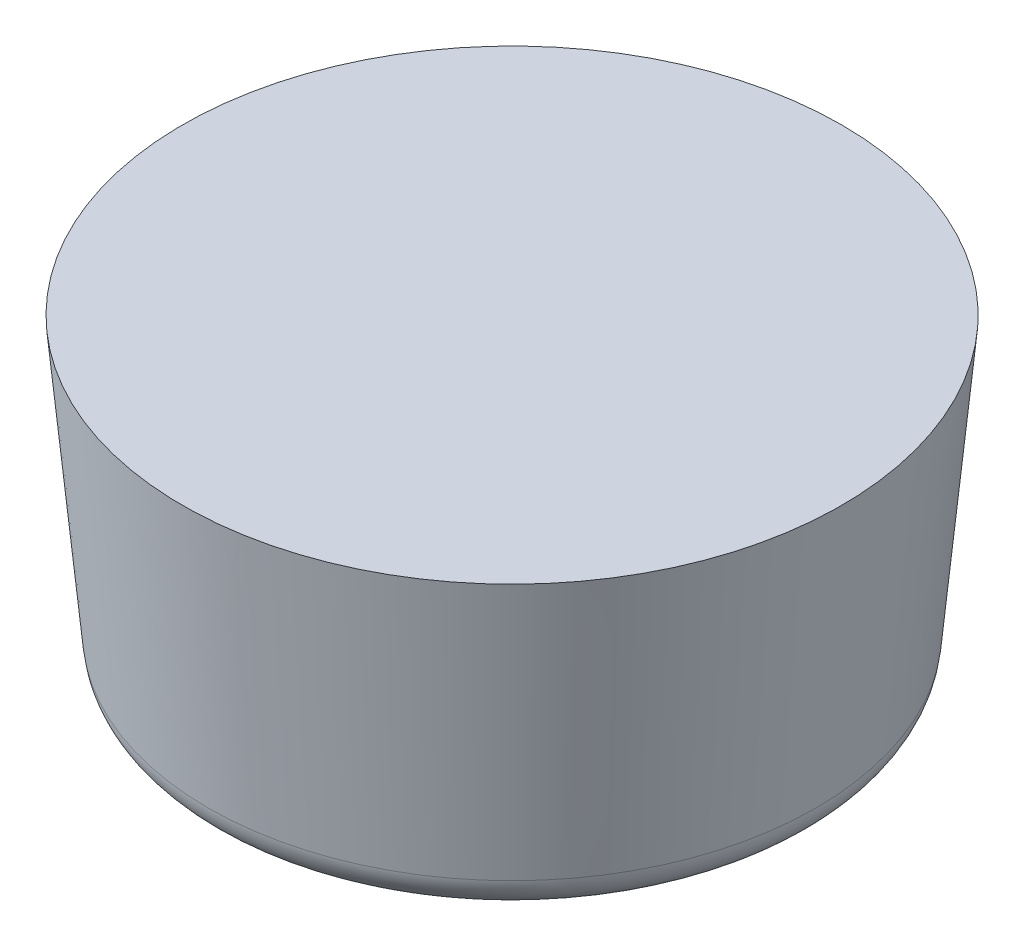
ISO-10303-21;
HEADER;
FILE_DESCRIPTION(('STEP AP214'),'2;1');
FILE_NAME('part.step','',(''),(''),'','','');
FILE_SCHEMA(('AUTOMOTIVE_DESIGN { 1 0 10303 214 1 1 1 1 }'));
ENDSEC;
DATA;
#1=APPLICATION_CONTEXT('core data for automotive mechanical design processes');
#2=APPLICATION_PROTOCOL_DEFINITION('international standard','automotive_design',2000,#1);
#3=PRODUCT_CONTEXT('',#1,'mechanical');
#4=PRODUCT('Part','Part','',(#3));
#5=PRODUCT_RELATED_PRODUCT_CATEGORY('part','',(#4));
#6=PRODUCT_DEFINITION_FORMATION('','',#4);
#7=PRODUCT_DEFINITION_CONTEXT('part definition',#1,'design');
#8=PRODUCT_DEFINITION('design','',#6,#7);
#9=PRODUCT_DEFINITION_SHAPE('','',#8);
#10=(LENGTH_UNIT() NAMED_UNIT(*) SI_UNIT(.MILLI.,.METRE.));
#11=(NAMED_UNIT(*) PLANE_ANGLE_UNIT() SI_UNIT($,.RADIAN.));
#12=(NAMED_UNIT(*) SI_UNIT($,.STERADIAN.) SOLID_ANGLE_UNIT());
#13=UNCERTAINTY_MEASURE_WITH_UNIT(LENGTH_MEASURE(1.E-05),#10,'distance_accuracy_value','');
#14=(GEOMETRIC_REPRESENTATION_CONTEXT(3) GLOBAL_UNCERTAINTY_ASSIGNED_CONTEXT((#13)) GLOBAL_UNIT_ASSIGNED_CONTEXT((#10,
#11,#12)) REPRESENTATION_CONTEXT('',''));
#15=CARTESIAN_POINT('',(0.,0.,0.));
#16=DIRECTION('',(0.,0.,1.));
#17=DIRECTION('',(1.,0.,0.));
#18=AXIS2_PLACEMENT_3D('',#15,#16,#17);
#19=CARTESIAN_POINT('',(0.,16.,0.));
#20=DIRECTION('',(0.,-1.,0.));
#21=DIRECTION('',(0.,0.,-1.));
#22=AXIS2_PLACEMENT_3D('',#19,#20,#21);
#23=PLANE('',#22);
#24=CARTESIAN_POINT('',(0.,16.,0.));
#25=DIRECTION('',(0.,-1.,0.));
#26=DIRECTION('',(0.,0.,-1.));
#27=AXIS2_PLACEMENT_3D('',#24,#25,#26);
#28=CIRCLE('',#27,17.);
#29=CARTESIAN_POINT('',(0.,16.,-17.));
#30=VERTEX_POINT('',#29);
#31=EDGE_CURVE('E52',#30,#30,#28,.T.);
#32=ORIENTED_EDGE('',*,*,#31,.F.);
#33=EDGE_LOOP('',(#32));
#34=FACE_BOUND('',#33,.T.);
#35=ADVANCED_FACE('F32',(#34),#23,.F.);
#36=CARTESIAN_POINT('',(0.,16.,0.));
#37=DIRECTION('',(0.,1.,0.));
#38=DIRECTION('',(0.,0.,1.));
#39=AXIS2_PLACEMENT_3D('',#36,#37,#38);
#40=CONICAL_SURFACE('',#39,17.,0.0934767811585896);
#41=CARTESIAN_POINT('',(0.,1.81331858261391,0.));
#42=DIRECTION('',(0.,-1.,0.));
#43=DIRECTION('',(0.,0.,-1.));
#44=AXIS2_PLACEMENT_3D('',#41,#42,#43);
#45=CIRCLE('',#44,15.6699986171201);
#46=CARTESIAN_POINT('',(0.,1.81331858261391,-15.6699986171201));
#47=VERTEX_POINT('',#46);
#48=EDGE_CURVE('E10',#47,#47,#45,.F.);
#49=ORIENTED_EDGE('',*,*,#48,.T.);
#50=EDGE_LOOP('',(#49));
#51=FACE_BOUND('',#50,.T.);
#52=ORIENTED_EDGE('',*,*,#31,.T.);
#53=EDGE_LOOP('',(#52));
#54=FACE_BOUND('',#53,.T.);
#55=ADVANCED_FACE('F87',(#51,#54),#40,.T.);
#56=CARTESIAN_POINT('',(0.,0.,15.5));
#57=DIRECTION('',(0.,1.,0.));
#58=DIRECTION('',(0.,0.,1.));
#59=AXIS2_PLACEMENT_3D('',#56,#57,#58);
#60=PLANE('',#59);
#61=CARTESIAN_POINT('',(0.,0.,0.));
#62=DIRECTION('',(0.,1.,0.));
#63=DIRECTION('',(0.,0.,1.));
#64=AXIS2_PLACEMENT_3D('',#61,#62,#63);
#65=CIRCLE('',#64,9.5);
#66=CARTESIAN_POINT('',(0.,0.,9.5));
#67=VERTEX_POINT('',#66);
#68=EDGE_CURVE('E39',#67,#67,#65,.T.);
#69=ORIENTED_EDGE('',*,*,#68,.T.);
#70=EDGE_LOOP('',(#69));
#71=FACE_BOUND('',#70,.T.);
#72=CARTESIAN_POINT('',(0.,0.,0.));
#73=DIRECTION('',(0.,1.,0.));
#74=DIRECTION('',(0.,0.,1.));
#75=AXIS2_PLACEMENT_3D('',#72,#73,#74);
#76=CIRCLE('',#75,13.6787301650015);
#77=CARTESIAN_POINT('',(0.,0.,13.6787301650015));
#78=VERTEX_POINT('',#77);
#79=EDGE_CURVE('E43',#78,#78,#76,.F.);
#80=ORIENTED_EDGE('',*,*,#79,.T.);
#81=EDGE_LOOP('',(#80));
#82=FACE_BOUND('',#81,.T.);
#83=ADVANCED_FACE('F81',(#71,#82),#60,.F.);
#84=CARTESIAN_POINT('',(0.,0.,0.));
#85=DIRECTION('',(0.,-1.,0.));
#86=DIRECTION('',(0.,0.,-1.));
#87=AXIS2_PLACEMENT_3D('',#84,#85,#86);
#88=CYLINDRICAL_SURFACE('',#87,7.5);
#89=CARTESIAN_POINT('',(0.,2.,0.));
#90=DIRECTION('',(0.,1.,0.));
#91=DIRECTION('',(0.,0.,1.));
#92=AXIS2_PLACEMENT_3D('',#89,#90,#91);
#93=CIRCLE('',#92,7.5);
#94=CARTESIAN_POINT('',(0.,2.,7.5));
#95=VERTEX_POINT('',#94);
#96=EDGE_CURVE('E47',#95,#95,#93,.F.);
#97=ORIENTED_EDGE('',*,*,#96,.T.);
#98=EDGE_LOOP('',(#97));
#99=FACE_BOUND('',#98,.T.);
#100=CARTESIAN_POINT('',(0.,7.,0.));
#101=DIRECTION('',(0.,-1.,0.));
#102=DIRECTION('',(0.,0.,-1.));
#103=AXIS2_PLACEMENT_3D('',#100,#101,#102);
#104=CIRCLE('',#103,7.5);
#105=CARTESIAN_POINT('',(0.,7.,-7.5));
#106=VERTEX_POINT('',#105);
#107=EDGE_CURVE('E55',#106,#106,#104,.T.);
#108=ORIENTED_EDGE('',*,*,#107,.F.);
#109=EDGE_LOOP('',(#108));
#110=FACE_BOUND('',#109,.T.);
#111=ADVANCED_FACE('F76',(#99,#110),#88,.F.);
#112=CARTESIAN_POINT('',(0.,7.,7.5));
#113=DIRECTION('',(0.,1.,0.));
#114=DIRECTION('',(0.,0.,1.));
#115=AXIS2_PLACEMENT_3D('',#112,#113,#114);
#116=PLANE('',#115);
#117=CARTESIAN_POINT('',(0.,7.,0.));
#118=DIRECTION('',(0.,-1.,0.));
#119=DIRECTION('',(0.,0.,-1.));
#120=AXIS2_PLACEMENT_3D('',#117,#118,#119);
#121=CIRCLE('',#120,2.5);
#122=CARTESIAN_POINT('',(0.,7.,-2.5));
#123=VERTEX_POINT('',#122);
#124=EDGE_CURVE('E58',#123,#123,#121,.T.);
#125=ORIENTED_EDGE('',*,*,#124,.F.);
#126=EDGE_LOOP('',(#125));
#127=FACE_BOUND('',#126,.T.);
#128=ORIENTED_EDGE('',*,*,#107,.T.);
#129=EDGE_LOOP('',(#128));
#130=FACE_BOUND('',#129,.T.);
#131=ADVANCED_FACE('F70',(#127,#130),#116,.F.);
#132=CARTESIAN_POINT('',(0.,0.,0.));
#133=DIRECTION('',(0.,-1.,0.));
#134=DIRECTION('',(0.,0.,-1.));
#135=AXIS2_PLACEMENT_3D('',#132,#133,#134);
#136=CYLINDRICAL_SURFACE('',#135,2.5);
#137=CARTESIAN_POINT('',(0.,12.,0.));
#138=DIRECTION('',(0.,-1.,0.));
#139=DIRECTION('',(0.,0.,-1.));
#140=AXIS2_PLACEMENT_3D('',#137,#138,#139);
#141=CIRCLE('',#140,2.5);
#142=CARTESIAN_POINT('',(0.,12.,-2.5));
#143=VERTEX_POINT('',#142);
#144=EDGE_CURVE('E61',#143,#143,#141,.T.);
#145=ORIENTED_EDGE('',*,*,#144,.F.);
#146=EDGE_LOOP('',(#145));
#147=FACE_BOUND('',#146,.T.);
#148=ORIENTED_EDGE('',*,*,#124,.T.);
#149=EDGE_LOOP('',(#148));
#150=FACE_BOUND('',#149,.T.);
#151=ADVANCED_FACE('F67',(#147,#150),#136,.F.);
#152=CARTESIAN_POINT('',(0.,12.,2.5));
#153=DIRECTION('',(0.,1.,0.));
#154=DIRECTION('',(0.,0.,1.));
#155=AXIS2_PLACEMENT_3D('',#152,#153,#154);
#156=PLANE('',#155);
#157=ORIENTED_EDGE('',*,*,#144,.T.);
#158=EDGE_LOOP('',(#157));
#159=FACE_BOUND('',#158,.T.);
#160=ADVANCED_FACE('F65',(#159),#156,.F.);
#161=CARTESIAN_POINT('',(0.,2.,0.));
#162=DIRECTION('',(0.,1.,0.));
#163=DIRECTION('',(0.,0.,1.));
#164=AXIS2_PLACEMENT_3D('',#161,#162,#163);
#165=TOROIDAL_SURFACE('',#164,9.5,2.);
#166=ORIENTED_EDGE('',*,*,#68,.F.);
#167=EDGE_LOOP('',(#166));
#168=FACE_BOUND('',#167,.T.);
#169=ORIENTED_EDGE('',*,*,#96,.F.);
#170=EDGE_LOOP('',(#169));
#171=FACE_BOUND('',#170,.T.);
#172=ADVANCED_FACE('F97',(#168,#171),#165,.T.);
#173=CARTESIAN_POINT('',(0.,2.,0.));
#174=DIRECTION('',(0.,1.,0.));
#175=DIRECTION('',(0.,0.,1.));
#176=AXIS2_PLACEMENT_3D('',#173,#174,#175);
#177=TOROIDAL_SURFACE('',#176,13.6787301650015,2.);
#178=ORIENTED_EDGE('',*,*,#48,.F.);
#179=EDGE_LOOP('',(#178));
#180=FACE_BOUND('',#179,.T.);
#181=ORIENTED_EDGE('',*,*,#79,.F.);
#182=EDGE_LOOP('',(#181));
#183=FACE_BOUND('',#182,.T.);
#184=ADVANCED_FACE('F34',(#180,#183),#177,.T.);
#185=CLOSED_SHELL('',(#35,#55,#83,#111,#131,#151,#160,#172,#184));
#186=MANIFOLD_SOLID_BREP('B2',#185);
#187=ADVANCED_BREP_SHAPE_REPRESENTATION('',(#18,#186),#14);
#188=SHAPE_DEFINITION_REPRESENTATION(#9,#187);
ENDSEC;
END-ISO-10303-21;
